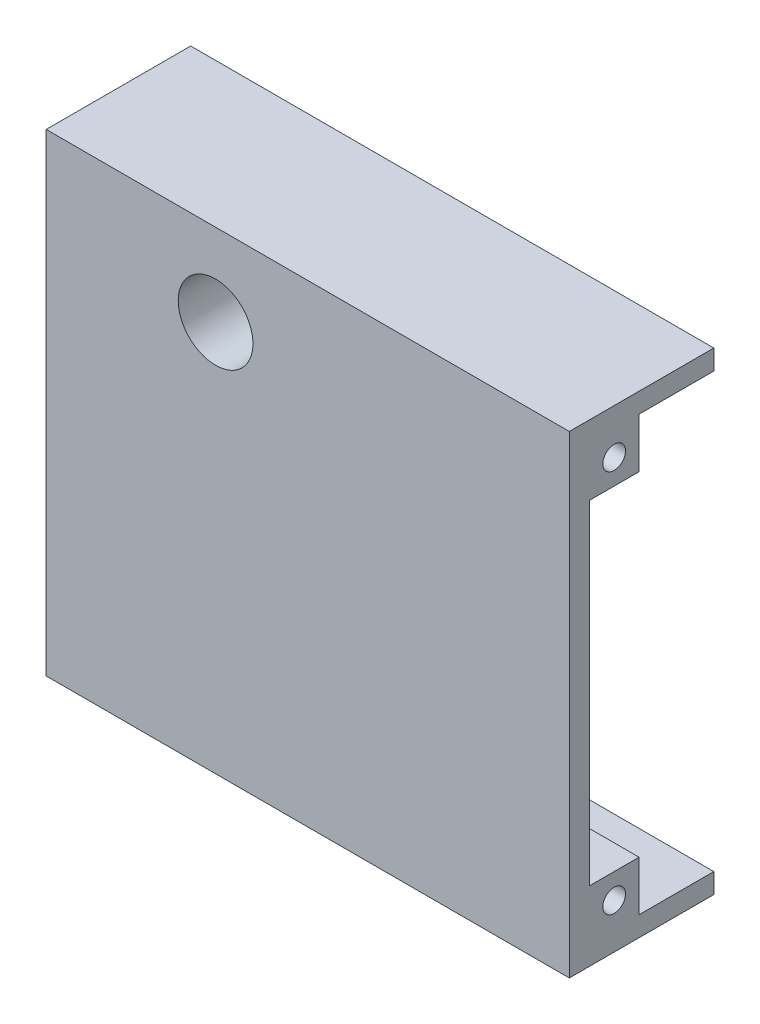
ISO-10303-21;
HEADER;
FILE_DESCRIPTION(('STEP AP214'),'2;1');
FILE_NAME('part.step','',(''),(''),'','','');
FILE_SCHEMA(('AUTOMOTIVE_DESIGN { 1 0 10303 214 1 1 1 1 }'));
ENDSEC;
DATA;
#1=APPLICATION_CONTEXT('core data for automotive mechanical design processes');
#2=APPLICATION_PROTOCOL_DEFINITION('international standard','automotive_design',2000,#1);
#3=PRODUCT_CONTEXT('',#1,'mechanical');
#4=PRODUCT('Part','Part','',(#3));
#5=PRODUCT_RELATED_PRODUCT_CATEGORY('part','',(#4));
#6=PRODUCT_DEFINITION_FORMATION('','',#4);
#7=PRODUCT_DEFINITION_CONTEXT('part definition',#1,'design');
#8=PRODUCT_DEFINITION('design','',#6,#7);
#9=PRODUCT_DEFINITION_SHAPE('','',#8);
#10=(LENGTH_UNIT() NAMED_UNIT(*) SI_UNIT(.MILLI.,.METRE.));
#11=(NAMED_UNIT(*) PLANE_ANGLE_UNIT() SI_UNIT($,.RADIAN.));
#12=(NAMED_UNIT(*) SI_UNIT($,.STERADIAN.) SOLID_ANGLE_UNIT());
#13=UNCERTAINTY_MEASURE_WITH_UNIT(LENGTH_MEASURE(1.E-05),#10,'distance_accuracy_value','');
#14=(GEOMETRIC_REPRESENTATION_CONTEXT(3) GLOBAL_UNCERTAINTY_ASSIGNED_CONTEXT((#13)) GLOBAL_UNIT_ASSIGNED_CONTEXT((#10,
#11,#12)) REPRESENTATION_CONTEXT('',''));
#15=CARTESIAN_POINT('',(0.,0.,0.));
#16=DIRECTION('',(0.,0.,1.));
#17=DIRECTION('',(1.,0.,0.));
#18=AXIS2_PLACEMENT_3D('',#15,#16,#17);
#19=CARTESIAN_POINT('',(0.,0.,0.));
#20=DIRECTION('',(0.,0.,1.));
#21=DIRECTION('',(1.,0.,0.));
#22=AXIS2_PLACEMENT_3D('',#19,#20,#21);
#23=PLANE('',#22);
#24=DIRECTION('',(0.,-1.,0.));
#25=VECTOR('',#24,1.);
#26=CARTESIAN_POINT('',(22.9999999999999,37.,0.));
#27=LINE('',#26,#25);
#28=CARTESIAN_POINT('',(22.9999999999999,87.,0.));
#29=VERTEX_POINT('',#28);
#30=CARTESIAN_POINT('',(22.9999999999999,37.,0.));
#31=VERTEX_POINT('',#30);
#32=EDGE_CURVE('E371',#29,#31,#27,.T.);
#33=ORIENTED_EDGE('',*,*,#32,.F.);
#34=DIRECTION('',(-1.,0.,0.));
#35=VECTOR('',#34,1.);
#36=CARTESIAN_POINT('',(-97.0000000000001,87.,0.));
#37=LINE('',#36,#35);
#38=CARTESIAN_POINT('',(85.,87.,0.));
#39=VERTEX_POINT('',#38);
#40=EDGE_CURVE('E272',#39,#29,#37,.T.);
#41=ORIENTED_EDGE('',*,*,#40,.F.);
#42=DIRECTION('',(0.,-1.,0.));
#43=VECTOR('',#42,1.);
#44=CARTESIAN_POINT('',(85.,87.,0.));
#45=LINE('',#44,#43);
#46=CARTESIAN_POINT('',(85.,67.,0.));
#47=VERTEX_POINT('',#46);
#48=EDGE_CURVE('E69',#39,#47,#45,.T.);
#49=ORIENTED_EDGE('',*,*,#48,.T.);
#50=DIRECTION('',(1.,0.,0.));
#51=VECTOR('',#50,1.);
#52=CARTESIAN_POINT('',(85.,67.,0.));
#53=LINE('',#52,#51);
#54=CARTESIAN_POINT('',(105.,67.,0.));
#55=VERTEX_POINT('',#54);
#56=EDGE_CURVE('E263',#47,#55,#53,.T.);
#57=ORIENTED_EDGE('',*,*,#56,.T.);
#58=DIRECTION('',(0.,1.,0.));
#59=VECTOR('',#58,1.);
#60=CARTESIAN_POINT('',(105.,95.,0.));
#61=LINE('',#60,#59);
#62=CARTESIAN_POINT('',(105.,-67.,0.));
#63=VERTEX_POINT('',#62);
#64=EDGE_CURVE('E197',#63,#55,#61,.T.);
#65=ORIENTED_EDGE('',*,*,#64,.F.);
#66=DIRECTION('',(1.,0.,0.));
#67=VECTOR('',#66,1.);
#68=CARTESIAN_POINT('',(85.,-67.,0.));
#69=LINE('',#68,#67);
#70=CARTESIAN_POINT('',(85.,-67.,0.));
#71=VERTEX_POINT('',#70);
#72=EDGE_CURVE('E239',#71,#63,#69,.T.);
#73=ORIENTED_EDGE('',*,*,#72,.F.);
#74=DIRECTION('',(0.,1.,0.));
#75=VECTOR('',#74,1.);
#76=CARTESIAN_POINT('',(85.,-87.,0.));
#77=LINE('',#76,#75);
#78=CARTESIAN_POINT('',(85.,-87.,0.));
#79=VERTEX_POINT('',#78);
#80=EDGE_CURVE('E349',#79,#71,#77,.T.);
#81=ORIENTED_EDGE('',*,*,#80,.F.);
#82=DIRECTION('',(1.,0.,0.));
#83=VECTOR('',#82,1.);
#84=CARTESIAN_POINT('',(105.,-87.,0.));
#85=LINE('',#84,#83);
#86=CARTESIAN_POINT('',(-97.0000000000001,-87.,0.));
#87=VERTEX_POINT('',#86);
#88=EDGE_CURVE('E283',#87,#79,#85,.T.);
#89=ORIENTED_EDGE('',*,*,#88,.F.);
#90=DIRECTION('',(0.,-1.,0.));
#91=VECTOR('',#90,1.);
#92=CARTESIAN_POINT('',(-97.0000000000001,-87.,0.));
#93=LINE('',#92,#91);
#94=CARTESIAN_POINT('',(-97.0000000000001,37.,0.));
#95=VERTEX_POINT('',#94);
#96=EDGE_CURVE('E309',#95,#87,#93,.T.);
#97=ORIENTED_EDGE('',*,*,#96,.F.);
#98=DIRECTION('',(-1.,0.,0.));
#99=VECTOR('',#98,1.);
#100=CARTESIAN_POINT('',(-97.0000000000001,37.,0.));
#101=LINE('',#100,#99);
#102=EDGE_CURVE('E175',#31,#95,#101,.T.);
#103=ORIENTED_EDGE('',*,*,#102,.F.);
#104=EDGE_LOOP('',(#33,#41,#49,#57,#65,#73,#81,#89,#97,#103));
#105=FACE_BOUND('',#104,.T.);
#106=ADVANCED_FACE('F43',(#105),#23,.F.);
#107=CARTESIAN_POINT('',(-97.0000000000001,87.,-50.));
#108=DIRECTION('',(0.,1.,0.));
#109=DIRECTION('',(-1.,0.,0.));
#110=AXIS2_PLACEMENT_3D('',#107,#108,#109);
#111=PLANE('',#110);
#112=DIRECTION('',(0.,0.,1.));
#113=VECTOR('',#112,1.);
#114=CARTESIAN_POINT('',(22.9999999999999,87.,-25.));
#115=LINE('',#114,#113);
#116=CARTESIAN_POINT('',(22.9999999999999,87.,-25.));
#117=VERTEX_POINT('',#116);
#118=EDGE_CURVE('E184',#117,#29,#115,.T.);
#119=ORIENTED_EDGE('',*,*,#118,.F.);
#120=DIRECTION('',(1.,0.,0.));
#121=VECTOR('',#120,1.);
#122=CARTESIAN_POINT('',(-97.0000000000001,87.,-25.));
#123=LINE('',#122,#121);
#124=CARTESIAN_POINT('',(-97.0000000000001,87.,-25.));
#125=VERTEX_POINT('',#124);
#126=EDGE_CURVE('E169',#125,#117,#123,.T.);
#127=ORIENTED_EDGE('',*,*,#126,.F.);
#128=DIRECTION('',(0.,0.,1.));
#129=VECTOR('',#128,1.);
#130=CARTESIAN_POINT('',(-97.0000000000001,87.,-50.));
#131=LINE('',#130,#129);
#132=CARTESIAN_POINT('',(-97.0000000000001,87.,-50.));
#133=VERTEX_POINT('',#132);
#134=EDGE_CURVE('E181',#133,#125,#131,.T.);
#135=ORIENTED_EDGE('',*,*,#134,.F.);
#136=DIRECTION('',(-1.,0.,0.));
#137=VECTOR('',#136,1.);
#138=CARTESIAN_POINT('',(-97.0000000000001,87.,-50.));
#139=LINE('',#138,#137);
#140=CARTESIAN_POINT('',(105.,87.,-50.));
#141=VERTEX_POINT('',#140);
#142=EDGE_CURVE('E282',#141,#133,#139,.T.);
#143=ORIENTED_EDGE('',*,*,#142,.F.);
#144=DIRECTION('',(0.,0.,1.));
#145=VECTOR('',#144,1.);
#146=CARTESIAN_POINT('',(105.,87.,-50.));
#147=LINE('',#146,#145);
#148=CARTESIAN_POINT('',(105.,87.,-20.));
#149=VERTEX_POINT('',#148);
#150=EDGE_CURVE('E192',#141,#149,#147,.T.);
#151=ORIENTED_EDGE('',*,*,#150,.T.);
#152=DIRECTION('',(1.,0.,0.));
#153=VECTOR('',#152,1.);
#154=CARTESIAN_POINT('',(85.,87.,-20.));
#155=LINE('',#154,#153);
#156=CARTESIAN_POINT('',(85.,87.,-20.));
#157=VERTEX_POINT('',#156);
#158=EDGE_CURVE('E268',#157,#149,#155,.T.);
#159=ORIENTED_EDGE('',*,*,#158,.F.);
#160=DIRECTION('',(0.,0.,1.));
#161=VECTOR('',#160,1.);
#162=CARTESIAN_POINT('',(85.,87.,0.));
#163=LINE('',#162,#161);
#164=EDGE_CURVE('E261',#157,#39,#163,.T.);
#165=ORIENTED_EDGE('',*,*,#164,.T.);
#166=ORIENTED_EDGE('',*,*,#40,.T.);
#167=EDGE_LOOP('',(#119,#127,#135,#143,#151,#159,#165,#166));
#168=FACE_BOUND('',#167,.T.);
#169=ADVANCED_FACE('F180',(#168),#111,.F.);
#170=CARTESIAN_POINT('',(-97.0000000000001,-87.,-50.));
#171=DIRECTION('',(-1.,0.,0.));
#172=DIRECTION('',(0.,0.,1.));
#173=AXIS2_PLACEMENT_3D('',#170,#171,#172);
#174=PLANE('',#173);
#175=DIRECTION('',(0.,0.,1.));
#176=VECTOR('',#175,1.);
#177=CARTESIAN_POINT('',(-97.0000000000001,37.,-25.));
#178=LINE('',#177,#176);
#179=CARTESIAN_POINT('',(-97.0000000000001,37.,-25.));
#180=VERTEX_POINT('',#179);
#181=EDGE_CURVE('E61',#180,#95,#178,.T.);
#182=ORIENTED_EDGE('',*,*,#181,.T.);
#183=ORIENTED_EDGE('',*,*,#96,.T.);
#184=DIRECTION('',(0.,0.,1.));
#185=VECTOR('',#184,1.);
#186=CARTESIAN_POINT('',(-97.0000000000001,-87.,-50.));
#187=LINE('',#186,#185);
#188=CARTESIAN_POINT('',(-97.0000000000001,-87.,-50.));
#189=VERTEX_POINT('',#188);
#190=EDGE_CURVE('E193',#189,#87,#187,.T.);
#191=ORIENTED_EDGE('',*,*,#190,.F.);
#192=DIRECTION('',(0.,-1.,0.));
#193=VECTOR('',#192,1.);
#194=CARTESIAN_POINT('',(-97.0000000000001,-87.,-50.));
#195=LINE('',#194,#193);
#196=EDGE_CURVE('E190',#133,#189,#195,.T.);
#197=ORIENTED_EDGE('',*,*,#196,.F.);
#198=ORIENTED_EDGE('',*,*,#134,.T.);
#199=DIRECTION('',(0.,1.,0.));
#200=VECTOR('',#199,1.);
#201=CARTESIAN_POINT('',(-97.0000000000001,37.,-25.));
#202=LINE('',#201,#200);
#203=EDGE_CURVE('E166',#180,#125,#202,.T.);
#204=ORIENTED_EDGE('',*,*,#203,.F.);
#205=EDGE_LOOP('',(#182,#183,#191,#197,#198,#204));
#206=FACE_BOUND('',#205,.T.);
#207=ADVANCED_FACE('F188',(#206),#174,.F.);
#208=CARTESIAN_POINT('',(105.,-87.,-50.));
#209=DIRECTION('',(0.,-1.,0.));
#210=DIRECTION('',(0.,0.,-1.));
#211=AXIS2_PLACEMENT_3D('',#208,#209,#210);
#212=PLANE('',#211);
#213=DIRECTION('',(1.,0.,0.));
#214=VECTOR('',#213,1.);
#215=CARTESIAN_POINT('',(85.,-87.,-20.));
#216=LINE('',#215,#214);
#217=CARTESIAN_POINT('',(85.,-87.,-20.));
#218=VERTEX_POINT('',#217);
#219=CARTESIAN_POINT('',(105.,-87.,-20.));
#220=VERTEX_POINT('',#219);
#221=EDGE_CURVE('E249',#218,#220,#216,.T.);
#222=ORIENTED_EDGE('',*,*,#221,.T.);
#223=DIRECTION('',(0.,0.,1.));
#224=VECTOR('',#223,1.);
#225=CARTESIAN_POINT('',(105.,-87.,-50.));
#226=LINE('',#225,#224);
#227=CARTESIAN_POINT('',(105.,-87.,-50.));
#228=VERTEX_POINT('',#227);
#229=EDGE_CURVE('E200',#228,#220,#226,.T.);
#230=ORIENTED_EDGE('',*,*,#229,.F.);
#231=DIRECTION('',(1.,0.,0.));
#232=VECTOR('',#231,1.);
#233=CARTESIAN_POINT('',(105.,-87.,-50.));
#234=LINE('',#233,#232);
#235=EDGE_CURVE('E288',#189,#228,#234,.T.);
#236=ORIENTED_EDGE('',*,*,#235,.F.);
#237=ORIENTED_EDGE('',*,*,#190,.T.);
#238=ORIENTED_EDGE('',*,*,#88,.T.);
#239=DIRECTION('',(0.,0.,1.));
#240=VECTOR('',#239,1.);
#241=CARTESIAN_POINT('',(85.,-87.,0.));
#242=LINE('',#241,#240);
#243=EDGE_CURVE('E328',#218,#79,#242,.T.);
#244=ORIENTED_EDGE('',*,*,#243,.F.);
#245=EDGE_LOOP('',(#222,#230,#236,#237,#238,#244));
#246=FACE_BOUND('',#245,.T.);
#247=ADVANCED_FACE('F325',(#246),#212,.F.);
#248=CARTESIAN_POINT('',(105.,95.,8.));
#249=DIRECTION('',(-1.,0.,0.));
#250=DIRECTION('',(0.,-1.,0.));
#251=AXIS2_PLACEMENT_3D('',#248,#249,#250);
#252=PLANE('',#251);
#253=CARTESIAN_POINT('',(105.,-77.,-10.));
#254=DIRECTION('',(-1.,0.,0.));
#255=DIRECTION('',(0.,-1.,0.));
#256=AXIS2_PLACEMENT_3D('',#253,#254,#255);
#257=CIRCLE('',#256,4.55);
#258=CARTESIAN_POINT('',(105.,-81.55,-10.));
#259=VERTEX_POINT('',#258);
#260=EDGE_CURVE('E357',#259,#259,#257,.T.);
#261=ORIENTED_EDGE('',*,*,#260,.T.);
#262=EDGE_LOOP('',(#261));
#263=FACE_BOUND('',#262,.T.);
#264=DIRECTION('',(0.,0.,-1.));
#265=VECTOR('',#264,1.);
#266=CARTESIAN_POINT('',(105.,-67.,0.));
#267=LINE('',#266,#265);
#268=CARTESIAN_POINT('',(105.,-67.,-20.));
#269=VERTEX_POINT('',#268);
#270=EDGE_CURVE('E347',#63,#269,#267,.T.);
#271=ORIENTED_EDGE('',*,*,#270,.F.);
#272=ORIENTED_EDGE('',*,*,#64,.T.);
#273=DIRECTION('',(0.,0.,-1.));
#274=VECTOR('',#273,1.);
#275=CARTESIAN_POINT('',(105.,67.,0.));
#276=LINE('',#275,#274);
#277=CARTESIAN_POINT('',(105.,67.,-20.));
#278=VERTEX_POINT('',#277);
#279=EDGE_CURVE('E229',#55,#278,#276,.T.);
#280=ORIENTED_EDGE('',*,*,#279,.T.);
#281=DIRECTION('',(0.,1.,0.));
#282=VECTOR('',#281,1.);
#283=CARTESIAN_POINT('',(105.,87.,-20.));
#284=LINE('',#283,#282);
#285=EDGE_CURVE('E236',#278,#149,#284,.T.);
#286=ORIENTED_EDGE('',*,*,#285,.T.);
#287=ORIENTED_EDGE('',*,*,#150,.F.);
#288=DIRECTION('',(0.,-1.,0.));
#289=VECTOR('',#288,1.);
#290=CARTESIAN_POINT('',(105.,87.,-50.));
#291=LINE('',#290,#289);
#292=CARTESIAN_POINT('',(105.,95.,-50.));
#293=VERTEX_POINT('',#292);
#294=EDGE_CURVE('E278',#293,#141,#291,.T.);
#295=ORIENTED_EDGE('',*,*,#294,.F.);
#296=DIRECTION('',(0.,0.,-1.));
#297=VECTOR('',#296,1.);
#298=CARTESIAN_POINT('',(105.,95.,8.));
#299=LINE('',#298,#297);
#300=CARTESIAN_POINT('',(105.,95.,8.));
#301=VERTEX_POINT('',#300);
#302=EDGE_CURVE('E11',#301,#293,#299,.T.);
#303=ORIENTED_EDGE('',*,*,#302,.F.);
#304=DIRECTION('',(0.,1.,0.));
#305=VECTOR('',#304,1.);
#306=CARTESIAN_POINT('',(105.,95.,8.));
#307=LINE('',#306,#305);
#308=CARTESIAN_POINT('',(105.,-95.,8.));
#309=VERTEX_POINT('',#308);
#310=EDGE_CURVE('E204',#309,#301,#307,.T.);
#311=ORIENTED_EDGE('',*,*,#310,.F.);
#312=DIRECTION('',(0.,0.,-1.));
#313=VECTOR('',#312,1.);
#314=CARTESIAN_POINT('',(105.,-95.,8.));
#315=LINE('',#314,#313);
#316=CARTESIAN_POINT('',(105.,-95.,-50.));
#317=VERTEX_POINT('',#316);
#318=EDGE_CURVE('E217',#309,#317,#315,.T.);
#319=ORIENTED_EDGE('',*,*,#318,.T.);
#320=DIRECTION('',(0.,-1.,0.));
#321=VECTOR('',#320,1.);
#322=CARTESIAN_POINT('',(105.,-95.,-50.));
#323=LINE('',#322,#321);
#324=EDGE_CURVE('E291',#228,#317,#323,.T.);
#325=ORIENTED_EDGE('',*,*,#324,.F.);
#326=ORIENTED_EDGE('',*,*,#229,.T.);
#327=DIRECTION('',(0.,-1.,0.));
#328=VECTOR('',#327,1.);
#329=CARTESIAN_POINT('',(105.,-87.,-20.));
#330=LINE('',#329,#328);
#331=EDGE_CURVE('E321',#269,#220,#330,.T.);
#332=ORIENTED_EDGE('',*,*,#331,.F.);
#333=EDGE_LOOP('',(#271,#272,#280,#286,#287,#295,#303,#311,#319,#325,#326,#332));
#334=FACE_BOUND('',#333,.T.);
#335=CARTESIAN_POINT('',(105.,77.,-10.));
#336=DIRECTION('',(1.,0.,0.));
#337=DIRECTION('',(0.,1.,0.));
#338=AXIS2_PLACEMENT_3D('',#335,#336,#337);
#339=CIRCLE('',#338,4.55);
#340=CARTESIAN_POINT('',(105.,81.55,-10.));
#341=VERTEX_POINT('',#340);
#342=EDGE_CURVE('E230',#341,#341,#339,.T.);
#343=ORIENTED_EDGE('',*,*,#342,.F.);
#344=EDGE_LOOP('',(#343));
#345=FACE_BOUND('',#344,.T.);
#346=ADVANCED_FACE('F45',(#263,#334,#345),#252,.F.);
#347=CARTESIAN_POINT('',(-105.,95.,8.));
#348=DIRECTION('',(0.,-1.,0.));
#349=DIRECTION('',(0.,0.,-1.));
#350=AXIS2_PLACEMENT_3D('',#347,#348,#349);
#351=PLANE('',#350);
#352=ORIENTED_EDGE('',*,*,#302,.T.);
#353=DIRECTION('',(1.,0.,0.));
#354=VECTOR('',#353,1.);
#355=CARTESIAN_POINT('',(105.,95.,-50.));
#356=LINE('',#355,#354);
#357=CARTESIAN_POINT('',(-105.,95.,-50.));
#358=VERTEX_POINT('',#357);
#359=EDGE_CURVE('E303',#358,#293,#356,.T.);
#360=ORIENTED_EDGE('',*,*,#359,.F.);
#361=DIRECTION('',(0.,0.,-1.));
#362=VECTOR('',#361,1.);
#363=CARTESIAN_POINT('',(-105.,95.,8.));
#364=LINE('',#363,#362);
#365=CARTESIAN_POINT('',(-105.,95.,8.));
#366=VERTEX_POINT('',#365);
#367=EDGE_CURVE('E53',#366,#358,#364,.T.);
#368=ORIENTED_EDGE('',*,*,#367,.F.);
#369=DIRECTION('',(-1.,0.,0.));
#370=VECTOR('',#369,1.);
#371=CARTESIAN_POINT('',(-105.,95.,8.));
#372=LINE('',#371,#370);
#373=EDGE_CURVE('E208',#301,#366,#372,.T.);
#374=ORIENTED_EDGE('',*,*,#373,.F.);
#375=EDGE_LOOP('',(#352,#360,#368,#374));
#376=FACE_BOUND('',#375,.T.);
#377=ADVANCED_FACE('F420',(#376),#351,.F.);
#378=CARTESIAN_POINT('',(-105.,95.,8.));
#379=DIRECTION('',(1.,0.,0.));
#380=DIRECTION('',(0.,1.,0.));
#381=AXIS2_PLACEMENT_3D('',#378,#379,#380);
#382=PLANE('',#381);
#383=ORIENTED_EDGE('',*,*,#367,.T.);
#384=DIRECTION('',(0.,1.,0.));
#385=VECTOR('',#384,1.);
#386=CARTESIAN_POINT('',(-105.,95.,-50.));
#387=LINE('',#386,#385);
#388=CARTESIAN_POINT('',(-105.,-95.,-50.));
#389=VERTEX_POINT('',#388);
#390=EDGE_CURVE('E299',#389,#358,#387,.T.);
#391=ORIENTED_EDGE('',*,*,#390,.F.);
#392=DIRECTION('',(0.,0.,-1.));
#393=VECTOR('',#392,1.);
#394=CARTESIAN_POINT('',(-105.,-95.,8.));
#395=LINE('',#394,#393);
#396=CARTESIAN_POINT('',(-105.,-95.,8.));
#397=VERTEX_POINT('',#396);
#398=EDGE_CURVE('E222',#397,#389,#395,.T.);
#399=ORIENTED_EDGE('',*,*,#398,.F.);
#400=DIRECTION('',(0.,-1.,0.));
#401=VECTOR('',#400,1.);
#402=CARTESIAN_POINT('',(-105.,95.,8.));
#403=LINE('',#402,#401);
#404=EDGE_CURVE('E211',#366,#397,#403,.T.);
#405=ORIENTED_EDGE('',*,*,#404,.F.);
#406=EDGE_LOOP('',(#383,#391,#399,#405));
#407=FACE_BOUND('',#406,.T.);
#408=ADVANCED_FACE('F417',(#407),#382,.F.);
#409=CARTESIAN_POINT('',(-105.,-95.,8.));
#410=DIRECTION('',(0.,1.,0.));
#411=DIRECTION('',(0.,0.,1.));
#412=AXIS2_PLACEMENT_3D('',#409,#410,#411);
#413=PLANE('',#412);
#414=ORIENTED_EDGE('',*,*,#398,.T.);
#415=DIRECTION('',(-1.,0.,0.));
#416=VECTOR('',#415,1.);
#417=CARTESIAN_POINT('',(-105.,-95.,-50.));
#418=LINE('',#417,#416);
#419=EDGE_CURVE('E295',#317,#389,#418,.T.);
#420=ORIENTED_EDGE('',*,*,#419,.F.);
#421=ORIENTED_EDGE('',*,*,#318,.F.);
#422=DIRECTION('',(1.,0.,0.));
#423=VECTOR('',#422,1.);
#424=CARTESIAN_POINT('',(-105.,-95.,8.));
#425=LINE('',#424,#423);
#426=EDGE_CURVE('E214',#397,#309,#425,.T.);
#427=ORIENTED_EDGE('',*,*,#426,.F.);
#428=EDGE_LOOP('',(#414,#420,#421,#427));
#429=FACE_BOUND('',#428,.T.);
#430=ADVANCED_FACE('F414',(#429),#413,.F.);
#431=CARTESIAN_POINT('',(0.,0.,8.));
#432=DIRECTION('',(0.,0.,1.));
#433=DIRECTION('',(1.,0.,0.));
#434=AXIS2_PLACEMENT_3D('',#431,#432,#433);
#435=PLANE('',#434);
#436=CARTESIAN_POINT('',(-37.0000000000001,62.,8.));
#437=DIRECTION('',(0.,0.,-1.));
#438=DIRECTION('',(-1.,0.,0.));
#439=AXIS2_PLACEMENT_3D('',#436,#437,#438);
#440=CIRCLE('',#439,15.);
#441=CARTESIAN_POINT('',(-52.0000000000001,62.,8.));
#442=VERTEX_POINT('',#441);
#443=EDGE_CURVE('E374',#442,#442,#440,.T.);
#444=ORIENTED_EDGE('',*,*,#443,.T.);
#445=EDGE_LOOP('',(#444));
#446=FACE_BOUND('',#445,.T.);
#447=ORIENTED_EDGE('',*,*,#310,.T.);
#448=ORIENTED_EDGE('',*,*,#373,.T.);
#449=ORIENTED_EDGE('',*,*,#404,.T.);
#450=ORIENTED_EDGE('',*,*,#426,.T.);
#451=EDGE_LOOP('',(#447,#448,#449,#450));
#452=FACE_BOUND('',#451,.T.);
#453=ADVANCED_FACE('F387',(#446,#452),#435,.T.);
#454=CARTESIAN_POINT('',(0.,0.,-50.));
#455=DIRECTION('',(0.,0.,1.));
#456=DIRECTION('',(1.,0.,0.));
#457=AXIS2_PLACEMENT_3D('',#454,#455,#456);
#458=PLANE('',#457);
#459=ORIENTED_EDGE('',*,*,#294,.T.);
#460=ORIENTED_EDGE('',*,*,#142,.T.);
#461=ORIENTED_EDGE('',*,*,#196,.T.);
#462=ORIENTED_EDGE('',*,*,#235,.T.);
#463=ORIENTED_EDGE('',*,*,#324,.T.);
#464=ORIENTED_EDGE('',*,*,#419,.T.);
#465=ORIENTED_EDGE('',*,*,#390,.T.);
#466=ORIENTED_EDGE('',*,*,#359,.T.);
#467=EDGE_LOOP('',(#459,#460,#461,#462,#463,#464,#465,#466));
#468=FACE_BOUND('',#467,.T.);
#469=ADVANCED_FACE('F434',(#468),#458,.F.);
#470=CARTESIAN_POINT('',(85.,87.,-20.));
#471=DIRECTION('',(0.,0.,-1.));
#472=DIRECTION('',(0.,1.,0.));
#473=AXIS2_PLACEMENT_3D('',#470,#471,#472);
#474=PLANE('',#473);
#475=ORIENTED_EDGE('',*,*,#285,.F.);
#476=DIRECTION('',(1.,0.,0.));
#477=VECTOR('',#476,1.);
#478=CARTESIAN_POINT('',(85.,67.,-20.));
#479=LINE('',#478,#477);
#480=CARTESIAN_POINT('',(85.,67.,-20.));
#481=VERTEX_POINT('',#480);
#482=EDGE_CURVE('E273',#481,#278,#479,.T.);
#483=ORIENTED_EDGE('',*,*,#482,.F.);
#484=DIRECTION('',(0.,1.,0.));
#485=VECTOR('',#484,1.);
#486=CARTESIAN_POINT('',(85.,87.,-20.));
#487=LINE('',#486,#485);
#488=EDGE_CURVE('E257',#481,#157,#487,.T.);
#489=ORIENTED_EDGE('',*,*,#488,.T.);
#490=ORIENTED_EDGE('',*,*,#158,.T.);
#491=EDGE_LOOP('',(#475,#483,#489,#490));
#492=FACE_BOUND('',#491,.T.);
#493=ADVANCED_FACE('F439',(#492),#474,.T.);
#494=CARTESIAN_POINT('',(85.,67.,0.));
#495=DIRECTION('',(0.,-1.,0.));
#496=DIRECTION('',(1.,0.,0.));
#497=AXIS2_PLACEMENT_3D('',#494,#495,#496);
#498=PLANE('',#497);
#499=ORIENTED_EDGE('',*,*,#279,.F.);
#500=ORIENTED_EDGE('',*,*,#56,.F.);
#501=DIRECTION('',(0.,0.,-1.));
#502=VECTOR('',#501,1.);
#503=CARTESIAN_POINT('',(85.,67.,0.));
#504=LINE('',#503,#502);
#505=EDGE_CURVE('E253',#47,#481,#504,.T.);
#506=ORIENTED_EDGE('',*,*,#505,.T.);
#507=ORIENTED_EDGE('',*,*,#482,.T.);
#508=EDGE_LOOP('',(#499,#500,#506,#507));
#509=FACE_BOUND('',#508,.T.);
#510=ADVANCED_FACE('F475',(#509),#498,.T.);
#511=CARTESIAN_POINT('',(85.,0.,0.));
#512=DIRECTION('',(1.,0.,0.));
#513=DIRECTION('',(0.,0.,-1.));
#514=AXIS2_PLACEMENT_3D('',#511,#512,#513);
#515=PLANE('',#514);
#516=CARTESIAN_POINT('',(85.,77.,-10.));
#517=DIRECTION('',(1.,0.,0.));
#518=DIRECTION('',(0.,0.,-1.));
#519=AXIS2_PLACEMENT_3D('',#516,#517,#518);
#520=CIRCLE('',#519,4.55);
#521=CARTESIAN_POINT('',(85.,77.,-14.55));
#522=VERTEX_POINT('',#521);
#523=EDGE_CURVE('E226',#522,#522,#520,.T.);
#524=ORIENTED_EDGE('',*,*,#523,.T.);
#525=EDGE_LOOP('',(#524));
#526=FACE_BOUND('',#525,.T.);
#527=ORIENTED_EDGE('',*,*,#48,.F.);
#528=ORIENTED_EDGE('',*,*,#164,.F.);
#529=ORIENTED_EDGE('',*,*,#488,.F.);
#530=ORIENTED_EDGE('',*,*,#505,.F.);
#531=EDGE_LOOP('',(#527,#528,#529,#530));
#532=FACE_BOUND('',#531,.T.);
#533=ADVANCED_FACE('F444',(#526,#532),#515,.F.);
#534=CARTESIAN_POINT('',(80.,77.,-10.));
#535=DIRECTION('',(1.,0.,0.));
#536=DIRECTION('',(0.,1.,0.));
#537=AXIS2_PLACEMENT_3D('',#534,#535,#536);
#538=CYLINDRICAL_SURFACE('',#537,4.55);
#539=ORIENTED_EDGE('',*,*,#342,.T.);
#540=EDGE_LOOP('',(#539));
#541=FACE_BOUND('',#540,.T.);
#542=ORIENTED_EDGE('',*,*,#523,.F.);
#543=EDGE_LOOP('',(#542));
#544=FACE_BOUND('',#543,.T.);
#545=ADVANCED_FACE('F469',(#541,#544),#538,.F.);
#546=CARTESIAN_POINT('',(85.,-67.,0.));
#547=DIRECTION('',(0.,-1.,0.));
#548=DIRECTION('',(1.,0.,0.));
#549=AXIS2_PLACEMENT_3D('',#546,#547,#548);
#550=PLANE('',#549);
#551=ORIENTED_EDGE('',*,*,#270,.T.);
#552=DIRECTION('',(1.,0.,0.));
#553=VECTOR('',#552,1.);
#554=CARTESIAN_POINT('',(85.,-67.,-20.));
#555=LINE('',#554,#553);
#556=CARTESIAN_POINT('',(85.,-67.,-20.));
#557=VERTEX_POINT('',#556);
#558=EDGE_CURVE('E245',#557,#269,#555,.T.);
#559=ORIENTED_EDGE('',*,*,#558,.F.);
#560=DIRECTION('',(0.,0.,-1.));
#561=VECTOR('',#560,1.);
#562=CARTESIAN_POINT('',(85.,-67.,0.));
#563=LINE('',#562,#561);
#564=EDGE_CURVE('E332',#71,#557,#563,.T.);
#565=ORIENTED_EDGE('',*,*,#564,.F.);
#566=ORIENTED_EDGE('',*,*,#72,.T.);
#567=EDGE_LOOP('',(#551,#559,#565,#566));
#568=FACE_BOUND('',#567,.T.);
#569=ADVANCED_FACE('F451',(#568),#550,.F.);
#570=CARTESIAN_POINT('',(85.,-87.,-20.));
#571=DIRECTION('',(0.,0.,1.));
#572=DIRECTION('',(0.,-1.,0.));
#573=AXIS2_PLACEMENT_3D('',#570,#571,#572);
#574=PLANE('',#573);
#575=ORIENTED_EDGE('',*,*,#331,.T.);
#576=ORIENTED_EDGE('',*,*,#221,.F.);
#577=DIRECTION('',(0.,-1.,0.));
#578=VECTOR('',#577,1.);
#579=CARTESIAN_POINT('',(85.,-87.,-20.));
#580=LINE('',#579,#578);
#581=EDGE_CURVE('E336',#557,#218,#580,.T.);
#582=ORIENTED_EDGE('',*,*,#581,.F.);
#583=ORIENTED_EDGE('',*,*,#558,.T.);
#584=EDGE_LOOP('',(#575,#576,#582,#583));
#585=FACE_BOUND('',#584,.T.);
#586=ADVANCED_FACE('F452',(#585),#574,.F.);
#587=CARTESIAN_POINT('',(85.,0.,0.));
#588=DIRECTION('',(1.,0.,0.));
#589=DIRECTION('',(0.,0.,-1.));
#590=AXIS2_PLACEMENT_3D('',#587,#588,#589);
#591=PLANE('',#590);
#592=CARTESIAN_POINT('',(85.,-77.,-10.));
#593=DIRECTION('',(1.,0.,0.));
#594=DIRECTION('',(0.,1.,0.));
#595=AXIS2_PLACEMENT_3D('',#592,#593,#594);
#596=CIRCLE('',#595,4.55);
#597=CARTESIAN_POINT('',(85.,-72.45,-10.));
#598=VERTEX_POINT('',#597);
#599=EDGE_CURVE('E47',#598,#598,#596,.F.);
#600=ORIENTED_EDGE('',*,*,#599,.F.);
#601=EDGE_LOOP('',(#600));
#602=FACE_BOUND('',#601,.T.);
#603=ORIENTED_EDGE('',*,*,#80,.T.);
#604=ORIENTED_EDGE('',*,*,#564,.T.);
#605=ORIENTED_EDGE('',*,*,#581,.T.);
#606=ORIENTED_EDGE('',*,*,#243,.T.);
#607=EDGE_LOOP('',(#603,#604,#605,#606));
#608=FACE_BOUND('',#607,.T.);
#609=ADVANCED_FACE('F453',(#602,#608),#591,.F.);
#610=CARTESIAN_POINT('',(80.,-77.,-10.));
#611=DIRECTION('',(1.,0.,0.));
#612=DIRECTION('',(0.,1.,0.));
#613=AXIS2_PLACEMENT_3D('',#610,#611,#612);
#614=CYLINDRICAL_SURFACE('',#613,4.55);
#615=ORIENTED_EDGE('',*,*,#260,.F.);
#616=EDGE_LOOP('',(#615));
#617=FACE_BOUND('',#616,.T.);
#618=ORIENTED_EDGE('',*,*,#599,.T.);
#619=EDGE_LOOP('',(#618));
#620=FACE_BOUND('',#619,.T.);
#621=ADVANCED_FACE('F455',(#617,#620),#614,.F.);
#622=CARTESIAN_POINT('',(22.9999999999999,37.,-25.));
#623=DIRECTION('',(-1.,0.,0.));
#624=DIRECTION('',(0.,0.,1.));
#625=AXIS2_PLACEMENT_3D('',#622,#623,#624);
#626=PLANE('',#625);
#627=ORIENTED_EDGE('',*,*,#32,.T.);
#628=DIRECTION('',(0.,0.,1.));
#629=VECTOR('',#628,1.);
#630=CARTESIAN_POINT('',(22.9999999999999,37.,-25.));
#631=LINE('',#630,#629);
#632=CARTESIAN_POINT('',(22.9999999999999,37.,-25.));
#633=VERTEX_POINT('',#632);
#634=EDGE_CURVE('E363',#633,#31,#631,.T.);
#635=ORIENTED_EDGE('',*,*,#634,.F.);
#636=DIRECTION('',(0.,-1.,0.));
#637=VECTOR('',#636,1.);
#638=CARTESIAN_POINT('',(22.9999999999999,37.,-25.));
#639=LINE('',#638,#637);
#640=EDGE_CURVE('E186',#117,#633,#639,.T.);
#641=ORIENTED_EDGE('',*,*,#640,.F.);
#642=ORIENTED_EDGE('',*,*,#118,.T.);
#643=EDGE_LOOP('',(#627,#635,#641,#642));
#644=FACE_BOUND('',#643,.T.);
#645=ADVANCED_FACE('F402',(#644),#626,.F.);
#646=CARTESIAN_POINT('',(-97.0000000000001,37.,-25.));
#647=DIRECTION('',(0.,1.,0.));
#648=DIRECTION('',(-1.,0.,0.));
#649=AXIS2_PLACEMENT_3D('',#646,#647,#648);
#650=PLANE('',#649);
#651=ORIENTED_EDGE('',*,*,#102,.T.);
#652=ORIENTED_EDGE('',*,*,#181,.F.);
#653=DIRECTION('',(-1.,0.,0.));
#654=VECTOR('',#653,1.);
#655=CARTESIAN_POINT('',(-97.0000000000001,37.,-25.));
#656=LINE('',#655,#654);
#657=EDGE_CURVE('E171',#633,#180,#656,.T.);
#658=ORIENTED_EDGE('',*,*,#657,.F.);
#659=ORIENTED_EDGE('',*,*,#634,.T.);
#660=EDGE_LOOP('',(#651,#652,#658,#659));
#661=FACE_BOUND('',#660,.T.);
#662=ADVANCED_FACE('F397',(#661),#650,.F.);
#663=CARTESIAN_POINT('',(0.,0.,-25.));
#664=DIRECTION('',(0.,0.,-1.));
#665=DIRECTION('',(-1.,0.,0.));
#666=AXIS2_PLACEMENT_3D('',#663,#664,#665);
#667=PLANE('',#666);
#668=CARTESIAN_POINT('',(-37.0000000000001,62.,-25.));
#669=DIRECTION('',(0.,0.,-1.));
#670=DIRECTION('',(-1.,0.,0.));
#671=AXIS2_PLACEMENT_3D('',#668,#669,#670);
#672=CIRCLE('',#671,15.);
#673=CARTESIAN_POINT('',(-52.0000000000001,62.,-25.));
#674=VERTEX_POINT('',#673);
#675=EDGE_CURVE('E379',#674,#674,#672,.T.);
#676=ORIENTED_EDGE('',*,*,#675,.F.);
#677=EDGE_LOOP('',(#676));
#678=FACE_BOUND('',#677,.T.);
#679=ORIENTED_EDGE('',*,*,#203,.T.);
#680=ORIENTED_EDGE('',*,*,#126,.T.);
#681=ORIENTED_EDGE('',*,*,#640,.T.);
#682=ORIENTED_EDGE('',*,*,#657,.T.);
#683=EDGE_LOOP('',(#679,#680,#681,#682));
#684=FACE_BOUND('',#683,.T.);
#685=ADVANCED_FACE('F168',(#678,#684),#667,.T.);
#686=CARTESIAN_POINT('',(-37.0000000000001,62.,8.));
#687=DIRECTION('',(0.,0.,-1.));
#688=DIRECTION('',(-1.,0.,0.));
#689=AXIS2_PLACEMENT_3D('',#686,#687,#688);
#690=CYLINDRICAL_SURFACE('',#689,15.);
#691=ORIENTED_EDGE('',*,*,#443,.F.);
#692=EDGE_LOOP('',(#691));
#693=FACE_BOUND('',#692,.T.);
#694=ORIENTED_EDGE('',*,*,#675,.T.);
#695=EDGE_LOOP('',(#694));
#696=FACE_BOUND('',#695,.T.);
#697=ADVANCED_FACE('F390',(#693,#696),#690,.F.);
#698=CLOSED_SHELL('',(#106,#169,#207,#247,#346,#377,#408,#430,#453,#469,#493,#510,#533,#545,
#569,#586,#609,#621,#645,#662,#685,#697));
#699=MANIFOLD_SOLID_BREP('B2',#698);
#700=ADVANCED_BREP_SHAPE_REPRESENTATION('',(#18,#699),#14);
#701=SHAPE_DEFINITION_REPRESENTATION(#9,#700);
ENDSEC;
END-ISO-10303-21;
